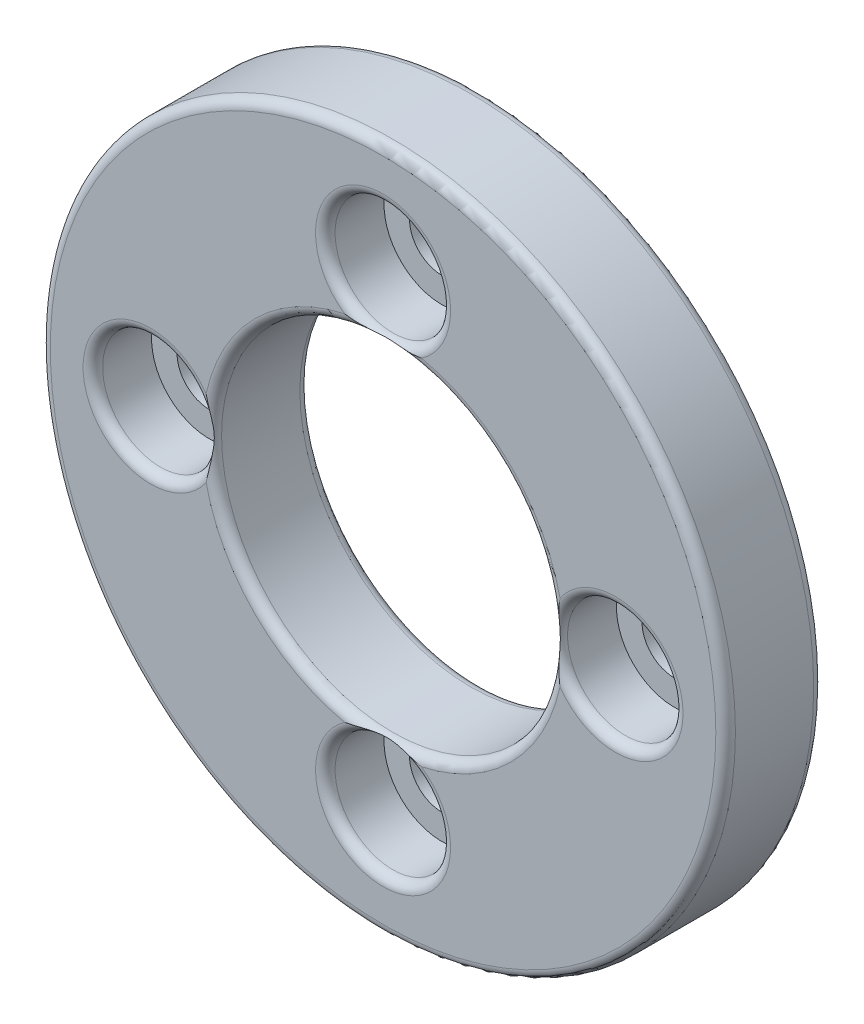
ISO-10303-21;
HEADER;
FILE_DESCRIPTION(('STEP AP214'),'2;1');
FILE_NAME('part.step','',(''),(''),'','','');
FILE_SCHEMA(('AUTOMOTIVE_DESIGN { 1 0 10303 214 1 1 1 1 }'));
ENDSEC;
DATA;
#1=APPLICATION_CONTEXT('core data for automotive mechanical design processes');
#2=APPLICATION_PROTOCOL_DEFINITION('international standard','automotive_design',2000,#1);
#3=PRODUCT_CONTEXT('',#1,'mechanical');
#4=PRODUCT('Part','Part','',(#3));
#5=PRODUCT_RELATED_PRODUCT_CATEGORY('part','',(#4));
#6=PRODUCT_DEFINITION_FORMATION('','',#4);
#7=PRODUCT_DEFINITION_CONTEXT('part definition',#1,'design');
#8=PRODUCT_DEFINITION('design','',#6,#7);
#9=PRODUCT_DEFINITION_SHAPE('','',#8);
#10=(LENGTH_UNIT() NAMED_UNIT(*) SI_UNIT(.MILLI.,.METRE.));
#11=(NAMED_UNIT(*) PLANE_ANGLE_UNIT() SI_UNIT($,.RADIAN.));
#12=(NAMED_UNIT(*) SI_UNIT($,.STERADIAN.) SOLID_ANGLE_UNIT());
#13=UNCERTAINTY_MEASURE_WITH_UNIT(LENGTH_MEASURE(1.E-05),#10,'distance_accuracy_value','');
#14=(GEOMETRIC_REPRESENTATION_CONTEXT(3) GLOBAL_UNCERTAINTY_ASSIGNED_CONTEXT((#13)) GLOBAL_UNIT_ASSIGNED_CONTEXT((#10,
#11,#12)) REPRESENTATION_CONTEXT('',''));
#15=CARTESIAN_POINT('',(0.,0.,0.));
#16=DIRECTION('',(0.,0.,1.));
#17=DIRECTION('',(1.,0.,0.));
#18=AXIS2_PLACEMENT_3D('',#15,#16,#17);
#19=CARTESIAN_POINT('',(0.,11.875,5.));
#20=DIRECTION('',(0.,0.,-1.));
#21=DIRECTION('',(-1.,0.,0.));
#22=AXIS2_PLACEMENT_3D('',#19,#20,#21);
#23=CYLINDRICAL_SURFACE('',#22,1.65);
#24=CARTESIAN_POINT('',(0.,11.875,0.5));
#25=DIRECTION('',(0.,0.,1.));
#26=DIRECTION('',(1.,0.,0.));
#27=AXIS2_PLACEMENT_3D('',#24,#25,#26);
#28=CIRCLE('',#27,1.65);
#29=CARTESIAN_POINT('',(1.65,11.875,0.5));
#30=VERTEX_POINT('',#29);
#31=EDGE_CURVE('E231',#30,#30,#28,.F.);
#32=ORIENTED_EDGE('',*,*,#31,.T.);
#33=EDGE_LOOP('',(#32));
#34=FACE_BOUND('',#33,.T.);
#35=CARTESIAN_POINT('',(0.,11.875,2.));
#36=DIRECTION('',(0.,0.,1.));
#37=DIRECTION('',(1.,0.,0.));
#38=AXIS2_PLACEMENT_3D('',#35,#36,#37);
#39=CIRCLE('',#38,1.65);
#40=CARTESIAN_POINT('',(1.65,11.875,2.));
#41=VERTEX_POINT('',#40);
#42=EDGE_CURVE('E263',#41,#41,#39,.T.);
#43=ORIENTED_EDGE('',*,*,#42,.T.);
#44=EDGE_LOOP('',(#43));
#45=FACE_BOUND('',#44,.T.);
#46=ADVANCED_FACE('F41',(#34,#45),#23,.F.);
#47=CARTESIAN_POINT('',(11.875,0.,5.));
#48=DIRECTION('',(0.,0.,-1.));
#49=DIRECTION('',(-1.,0.,0.));
#50=AXIS2_PLACEMENT_3D('',#47,#48,#49);
#51=CYLINDRICAL_SURFACE('',#50,1.65);
#52=CARTESIAN_POINT('',(11.875,0.,0.5));
#53=DIRECTION('',(0.,0.,1.));
#54=DIRECTION('',(1.,0.,0.));
#55=AXIS2_PLACEMENT_3D('',#52,#53,#54);
#56=CIRCLE('',#55,1.65);
#57=CARTESIAN_POINT('',(13.525,0.,0.5));
#58=VERTEX_POINT('',#57);
#59=EDGE_CURVE('E228',#58,#58,#56,.F.);
#60=ORIENTED_EDGE('',*,*,#59,.T.);
#61=EDGE_LOOP('',(#60));
#62=FACE_BOUND('',#61,.T.);
#63=CARTESIAN_POINT('',(11.875,0.,2.));
#64=DIRECTION('',(0.,0.,1.));
#65=DIRECTION('',(1.,0.,0.));
#66=AXIS2_PLACEMENT_3D('',#63,#64,#65);
#67=CIRCLE('',#66,1.65);
#68=CARTESIAN_POINT('',(13.525,0.,2.));
#69=VERTEX_POINT('',#68);
#70=EDGE_CURVE('E266',#69,#69,#67,.T.);
#71=ORIENTED_EDGE('',*,*,#70,.T.);
#72=EDGE_LOOP('',(#71));
#73=FACE_BOUND('',#72,.T.);
#74=ADVANCED_FACE('F148',(#62,#73),#51,.F.);
#75=CARTESIAN_POINT('',(0.,-11.875,5.));
#76=DIRECTION('',(0.,0.,-1.));
#77=DIRECTION('',(-1.,0.,0.));
#78=AXIS2_PLACEMENT_3D('',#75,#76,#77);
#79=CYLINDRICAL_SURFACE('',#78,1.65);
#80=CARTESIAN_POINT('',(0.,-11.875,0.5));
#81=DIRECTION('',(0.,0.,1.));
#82=DIRECTION('',(1.,0.,0.));
#83=AXIS2_PLACEMENT_3D('',#80,#81,#82);
#84=CIRCLE('',#83,1.65);
#85=CARTESIAN_POINT('',(1.64999999999992,-11.875,0.5));
#86=VERTEX_POINT('',#85);
#87=EDGE_CURVE('E225',#86,#86,#84,.F.);
#88=ORIENTED_EDGE('',*,*,#87,.T.);
#89=EDGE_LOOP('',(#88));
#90=FACE_BOUND('',#89,.T.);
#91=CARTESIAN_POINT('',(0.,-11.875,2.));
#92=DIRECTION('',(0.,0.,1.));
#93=DIRECTION('',(1.,0.,0.));
#94=AXIS2_PLACEMENT_3D('',#91,#92,#93);
#95=CIRCLE('',#94,1.65);
#96=CARTESIAN_POINT('',(1.64999999999992,-11.875,2.));
#97=VERTEX_POINT('',#96);
#98=EDGE_CURVE('E269',#97,#97,#95,.T.);
#99=ORIENTED_EDGE('',*,*,#98,.T.);
#100=EDGE_LOOP('',(#99));
#101=FACE_BOUND('',#100,.T.);
#102=ADVANCED_FACE('F155',(#90,#101),#79,.F.);
#103=CARTESIAN_POINT('',(-11.875,1.24384022696287E-13,5.));
#104=DIRECTION('',(0.,0.,-1.));
#105=DIRECTION('',(-1.,0.,0.));
#106=AXIS2_PLACEMENT_3D('',#103,#104,#105);
#107=CYLINDRICAL_SURFACE('',#106,1.65);
#108=CARTESIAN_POINT('',(-11.875,1.24384022696287E-13,0.5));
#109=DIRECTION('',(0.,0.,1.));
#110=DIRECTION('',(1.,0.,0.));
#111=AXIS2_PLACEMENT_3D('',#108,#109,#110);
#112=CIRCLE('',#111,1.65);
#113=CARTESIAN_POINT('',(-10.225,1.24384022696287E-13,0.5));
#114=VERTEX_POINT('',#113);
#115=EDGE_CURVE('E102',#114,#114,#112,.F.);
#116=ORIENTED_EDGE('',*,*,#115,.T.);
#117=EDGE_LOOP('',(#116));
#118=FACE_BOUND('',#117,.T.);
#119=CARTESIAN_POINT('',(-11.875,1.24384022696287E-13,2.));
#120=DIRECTION('',(0.,0.,1.));
#121=DIRECTION('',(1.,0.,0.));
#122=AXIS2_PLACEMENT_3D('',#119,#120,#121);
#123=CIRCLE('',#122,1.65);
#124=CARTESIAN_POINT('',(-10.225,1.24384022696287E-13,2.));
#125=VERTEX_POINT('',#124);
#126=EDGE_CURVE('E272',#125,#125,#123,.T.);
#127=ORIENTED_EDGE('',*,*,#126,.T.);
#128=EDGE_LOOP('',(#127));
#129=FACE_BOUND('',#128,.T.);
#130=ADVANCED_FACE('F166',(#118,#129),#107,.F.);
#131=CARTESIAN_POINT('',(0.,0.,5.));
#132=DIRECTION('',(0.,0.,-1.));
#133=DIRECTION('',(-1.,0.,0.));
#134=AXIS2_PLACEMENT_3D('',#131,#132,#133);
#135=CYLINDRICAL_SURFACE('',#134,8.75);
#136=CARTESIAN_POINT('',(0.,0.,0.5));
#137=DIRECTION('',(0.,0.,1.));
#138=DIRECTION('',(1.,0.,0.));
#139=AXIS2_PLACEMENT_3D('',#136,#137,#138);
#140=CIRCLE('',#139,8.75);
#141=CARTESIAN_POINT('',(8.75,0.,0.5));
#142=VERTEX_POINT('',#141);
#143=EDGE_CURVE('E233',#142,#142,#140,.F.);
#144=ORIENTED_EDGE('',*,*,#143,.T.);
#145=EDGE_LOOP('',(#144));
#146=FACE_BOUND('',#145,.T.);
#147=CARTESIAN_POINT('',(0.,0.,4.5));
#148=DIRECTION('',(0.,0.,1.));
#149=DIRECTION('',(1.,0.,0.));
#150=AXIS2_PLACEMENT_3D('',#147,#148,#149);
#151=CIRCLE('',#150,8.75);
#152=CARTESIAN_POINT('',(8.75,0.,4.5));
#153=VERTEX_POINT('',#152);
#154=EDGE_CURVE('E236',#153,#153,#151,.T.);
#155=ORIENTED_EDGE('',*,*,#154,.T.);
#156=EDGE_LOOP('',(#155));
#157=FACE_BOUND('',#156,.T.);
#158=ADVANCED_FACE('F161',(#146,#157),#135,.F.);
#159=CARTESIAN_POINT('',(0.,0.,5.));
#160=DIRECTION('',(0.,0.,-1.));
#161=DIRECTION('',(-1.,0.,0.));
#162=AXIS2_PLACEMENT_3D('',#159,#160,#161);
#163=CYLINDRICAL_SURFACE('',#162,17.5);
#164=CARTESIAN_POINT('',(0.,0.,0.5));
#165=DIRECTION('',(0.,0.,1.));
#166=DIRECTION('',(1.,0.,0.));
#167=AXIS2_PLACEMENT_3D('',#164,#165,#166);
#168=CIRCLE('',#167,17.5);
#169=CARTESIAN_POINT('',(17.5,0.,0.5));
#170=VERTEX_POINT('',#169);
#171=EDGE_CURVE('E257',#170,#170,#168,.T.);
#172=ORIENTED_EDGE('',*,*,#171,.T.);
#173=EDGE_LOOP('',(#172));
#174=FACE_BOUND('',#173,.T.);
#175=CARTESIAN_POINT('',(0.,0.,4.5));
#176=DIRECTION('',(0.,0.,1.));
#177=DIRECTION('',(1.,0.,0.));
#178=AXIS2_PLACEMENT_3D('',#175,#176,#177);
#179=CIRCLE('',#178,17.5);
#180=CARTESIAN_POINT('',(17.5,0.,4.5));
#181=VERTEX_POINT('',#180);
#182=EDGE_CURVE('E260',#181,#181,#179,.F.);
#183=ORIENTED_EDGE('',*,*,#182,.T.);
#184=EDGE_LOOP('',(#183));
#185=FACE_BOUND('',#184,.T.);
#186=ADVANCED_FACE('F321',(#174,#185),#163,.T.);
#187=CARTESIAN_POINT('',(0.,0.,5.));
#188=DIRECTION('',(0.,0.,1.));
#189=DIRECTION('',(1.,0.,0.));
#190=AXIS2_PLACEMENT_3D('',#187,#188,#189);
#191=PLANE('',#190);
#192=CARTESIAN_POINT('',(0.,0.,5.));
#193=DIRECTION('',(0.,0.,1.));
#194=DIRECTION('',(1.,0.,0.));
#195=AXIS2_PLACEMENT_3D('',#192,#193,#194);
#196=CIRCLE('',#195,17.);
#197=CARTESIAN_POINT('',(17.,0.,5.));
#198=VERTEX_POINT('',#197);
#199=EDGE_CURVE('E212',#198,#198,#196,.T.);
#200=ORIENTED_EDGE('',*,*,#199,.T.);
#201=EDGE_LOOP('',(#200));
#202=FACE_BOUND('',#201,.T.);
#203=CARTESIAN_POINT('',(0.,0.,5.));
#204=DIRECTION('',(0.,0.,1.));
#205=DIRECTION('',(1.,0.,0.));
#206=AXIS2_PLACEMENT_3D('',#203,#204,#205);
#207=CIRCLE('',#206,9.25);
#208=CARTESIAN_POINT('',(9.03897368421052,-1.96454949954174,5.));
#209=VERTEX_POINT('',#208);
#210=CARTESIAN_POINT('',(1.96454949954165,-9.03897368421054,5.));
#211=VERTEX_POINT('',#210);
#212=EDGE_CURVE('E63',#209,#211,#207,.F.);
#213=ORIENTED_EDGE('',*,*,#212,.T.);
#214=CARTESIAN_POINT('',(0.,-11.875,5.));
#215=DIRECTION('',(0.,0.,1.));
#216=DIRECTION('',(1.,0.,0.));
#217=AXIS2_PLACEMENT_3D('',#214,#215,#216);
#218=CIRCLE('',#217,3.45);
#219=CARTESIAN_POINT('',(-1.96454949954178,-9.03897368421051,5.));
#220=VERTEX_POINT('',#219);
#221=EDGE_CURVE('E67',#211,#220,#218,.F.);
#222=ORIENTED_EDGE('',*,*,#221,.T.);
#223=CARTESIAN_POINT('',(0.,0.,5.));
#224=DIRECTION('',(0.,0.,1.));
#225=DIRECTION('',(1.,0.,0.));
#226=AXIS2_PLACEMENT_3D('',#223,#224,#225);
#227=CIRCLE('',#226,9.25);
#228=CARTESIAN_POINT('',(-9.03897368421055,-1.96454949954162,5.));
#229=VERTEX_POINT('',#228);
#230=EDGE_CURVE('E217',#220,#229,#227,.F.);
#231=ORIENTED_EDGE('',*,*,#230,.T.);
#232=CARTESIAN_POINT('',(-11.875,1.24384022696287E-13,5.));
#233=DIRECTION('',(0.,0.,1.));
#234=DIRECTION('',(1.,0.,0.));
#235=AXIS2_PLACEMENT_3D('',#232,#233,#234);
#236=CIRCLE('',#235,3.45);
#237=CARTESIAN_POINT('',(-9.03897368421051,1.96454949954181,5.));
#238=VERTEX_POINT('',#237);
#239=EDGE_CURVE('E92',#229,#238,#236,.F.);
#240=ORIENTED_EDGE('',*,*,#239,.T.);
#241=CARTESIAN_POINT('',(0.,0.,5.));
#242=DIRECTION('',(0.,0.,1.));
#243=DIRECTION('',(1.,0.,0.));
#244=AXIS2_PLACEMENT_3D('',#241,#242,#243);
#245=CIRCLE('',#244,9.25);
#246=CARTESIAN_POINT('',(-1.96454949954171,9.03897368421053,5.));
#247=VERTEX_POINT('',#246);
#248=EDGE_CURVE('E85',#238,#247,#245,.F.);
#249=ORIENTED_EDGE('',*,*,#248,.T.);
#250=CARTESIAN_POINT('',(0.,11.875,5.));
#251=DIRECTION('',(0.,0.,1.));
#252=DIRECTION('',(1.,0.,0.));
#253=AXIS2_PLACEMENT_3D('',#250,#251,#252);
#254=CIRCLE('',#253,3.45);
#255=CARTESIAN_POINT('',(1.96454949954171,9.03897368421053,5.));
#256=VERTEX_POINT('',#255);
#257=EDGE_CURVE('E89',#247,#256,#254,.F.);
#258=ORIENTED_EDGE('',*,*,#257,.T.);
#259=CARTESIAN_POINT('',(0.,0.,5.));
#260=DIRECTION('',(0.,0.,1.));
#261=DIRECTION('',(1.,0.,0.));
#262=AXIS2_PLACEMENT_3D('',#259,#260,#261);
#263=CIRCLE('',#262,9.25);
#264=CARTESIAN_POINT('',(9.03897368421054,1.96454949954168,5.));
#265=VERTEX_POINT('',#264);
#266=EDGE_CURVE('E97',#256,#265,#263,.F.);
#267=ORIENTED_EDGE('',*,*,#266,.T.);
#268=CARTESIAN_POINT('',(11.875,0.,5.));
#269=DIRECTION('',(0.,0.,1.));
#270=DIRECTION('',(1.,0.,0.));
#271=AXIS2_PLACEMENT_3D('',#268,#269,#270);
#272=CIRCLE('',#271,3.45);
#273=EDGE_CURVE('E220',#265,#209,#272,.F.);
#274=ORIENTED_EDGE('',*,*,#273,.T.);
#275=EDGE_LOOP('',(#213,#222,#231,#240,#249,#258,#267,#274));
#276=FACE_BOUND('',#275,.T.);
#277=ADVANCED_FACE('F87',(#202,#276),#191,.T.);
#278=CARTESIAN_POINT('',(0.,0.,0.));
#279=DIRECTION('',(0.,0.,1.));
#280=DIRECTION('',(1.,0.,0.));
#281=AXIS2_PLACEMENT_3D('',#278,#279,#280);
#282=PLANE('',#281);
#283=CARTESIAN_POINT('',(0.,0.,0.));
#284=DIRECTION('',(0.,0.,1.));
#285=DIRECTION('',(1.,0.,0.));
#286=AXIS2_PLACEMENT_3D('',#283,#284,#285);
#287=CIRCLE('',#286,17.);
#288=CARTESIAN_POINT('',(17.,0.,0.));
#289=VERTEX_POINT('',#288);
#290=EDGE_CURVE('E239',#289,#289,#287,.F.);
#291=ORIENTED_EDGE('',*,*,#290,.T.);
#292=EDGE_LOOP('',(#291));
#293=FACE_BOUND('',#292,.T.);
#294=CARTESIAN_POINT('',(0.,0.,0.));
#295=DIRECTION('',(0.,0.,1.));
#296=DIRECTION('',(1.,0.,0.));
#297=AXIS2_PLACEMENT_3D('',#294,#295,#296);
#298=CIRCLE('',#297,9.25);
#299=CARTESIAN_POINT('',(9.25,0.,0.));
#300=VERTEX_POINT('',#299);
#301=EDGE_CURVE('E242',#300,#300,#298,.T.);
#302=ORIENTED_EDGE('',*,*,#301,.T.);
#303=EDGE_LOOP('',(#302));
#304=FACE_BOUND('',#303,.T.);
#305=CARTESIAN_POINT('',(0.,11.875,0.));
#306=DIRECTION('',(0.,0.,1.));
#307=DIRECTION('',(1.,0.,0.));
#308=AXIS2_PLACEMENT_3D('',#305,#306,#307);
#309=CIRCLE('',#308,2.15);
#310=CARTESIAN_POINT('',(2.15,11.875,0.));
#311=VERTEX_POINT('',#310);
#312=EDGE_CURVE('E245',#311,#311,#309,.T.);
#313=ORIENTED_EDGE('',*,*,#312,.T.);
#314=EDGE_LOOP('',(#313));
#315=FACE_BOUND('',#314,.T.);
#316=CARTESIAN_POINT('',(11.875,0.,0.));
#317=DIRECTION('',(0.,0.,1.));
#318=DIRECTION('',(1.,0.,0.));
#319=AXIS2_PLACEMENT_3D('',#316,#317,#318);
#320=CIRCLE('',#319,2.15);
#321=CARTESIAN_POINT('',(14.025,0.,0.));
#322=VERTEX_POINT('',#321);
#323=EDGE_CURVE('E248',#322,#322,#320,.T.);
#324=ORIENTED_EDGE('',*,*,#323,.T.);
#325=EDGE_LOOP('',(#324));
#326=FACE_BOUND('',#325,.T.);
#327=CARTESIAN_POINT('',(0.,-11.875,0.));
#328=DIRECTION('',(0.,0.,1.));
#329=DIRECTION('',(1.,0.,0.));
#330=AXIS2_PLACEMENT_3D('',#327,#328,#329);
#331=CIRCLE('',#330,2.15);
#332=CARTESIAN_POINT('',(2.14999999999992,-11.875,0.));
#333=VERTEX_POINT('',#332);
#334=EDGE_CURVE('E251',#333,#333,#331,.T.);
#335=ORIENTED_EDGE('',*,*,#334,.T.);
#336=EDGE_LOOP('',(#335));
#337=FACE_BOUND('',#336,.T.);
#338=CARTESIAN_POINT('',(-11.875,1.24384022696287E-13,0.));
#339=DIRECTION('',(0.,0.,1.));
#340=DIRECTION('',(1.,0.,0.));
#341=AXIS2_PLACEMENT_3D('',#338,#339,#340);
#342=CIRCLE('',#341,2.15);
#343=CARTESIAN_POINT('',(-9.725,1.24384022696287E-13,0.));
#344=VERTEX_POINT('',#343);
#345=EDGE_CURVE('E254',#344,#344,#342,.T.);
#346=ORIENTED_EDGE('',*,*,#345,.T.);
#347=EDGE_LOOP('',(#346));
#348=FACE_BOUND('',#347,.T.);
#349=ADVANCED_FACE('F314',(#293,#304,#315,#326,#337,#348),#282,.F.);
#350=CARTESIAN_POINT('',(-11.875,1.24384022696287E-13,2.));
#351=DIRECTION('',(0.,0.,1.));
#352=DIRECTION('',(1.,0.,0.));
#353=AXIS2_PLACEMENT_3D('',#350,#351,#352);
#354=CYLINDRICAL_SURFACE('',#353,2.95);
#355=CARTESIAN_POINT('',(-11.875,1.24384022696287E-13,4.5));
#356=DIRECTION('',(0.,0.,1.));
#357=DIRECTION('',(1.,0.,0.));
#358=AXIS2_PLACEMENT_3D('',#355,#356,#357);
#359=CIRCLE('',#358,2.95);
#360=CARTESIAN_POINT('',(-8.925,1.24384022696287E-13,4.5));
#361=VERTEX_POINT('',#360);
#362=EDGE_CURVE('E209',#361,#361,#359,.T.);
#363=ORIENTED_EDGE('',*,*,#362,.T.);
#364=EDGE_LOOP('',(#363));
#365=FACE_BOUND('',#364,.T.);
#366=CARTESIAN_POINT('',(-11.875,1.24384022696287E-13,2.));
#367=DIRECTION('',(0.,0.,1.));
#368=DIRECTION('',(1.,0.,0.));
#369=AXIS2_PLACEMENT_3D('',#366,#367,#368);
#370=CIRCLE('',#369,2.95);
#371=CARTESIAN_POINT('',(-8.925,1.24384022696287E-13,2.));
#372=VERTEX_POINT('',#371);
#373=EDGE_CURVE('E105',#372,#372,#370,.T.);
#374=ORIENTED_EDGE('',*,*,#373,.F.);
#375=EDGE_LOOP('',(#374));
#376=FACE_BOUND('',#375,.T.);
#377=ADVANCED_FACE('F311',(#365,#376),#354,.F.);
#378=CARTESIAN_POINT('',(-11.875,1.24384022696287E-13,2.));
#379=DIRECTION('',(0.,0.,1.));
#380=DIRECTION('',(1.,0.,0.));
#381=AXIS2_PLACEMENT_3D('',#378,#379,#380);
#382=PLANE('',#381);
#383=ORIENTED_EDGE('',*,*,#126,.F.);
#384=EDGE_LOOP('',(#383));
#385=FACE_BOUND('',#384,.T.);
#386=ORIENTED_EDGE('',*,*,#373,.T.);
#387=EDGE_LOOP('',(#386));
#388=FACE_BOUND('',#387,.T.);
#389=ADVANCED_FACE('F306',(#385,#388),#382,.T.);
#390=CARTESIAN_POINT('',(0.,-11.875,2.));
#391=DIRECTION('',(0.,0.,1.));
#392=DIRECTION('',(1.,0.,0.));
#393=AXIS2_PLACEMENT_3D('',#390,#391,#392);
#394=CYLINDRICAL_SURFACE('',#393,2.95);
#395=CARTESIAN_POINT('',(0.,-11.875,4.5));
#396=DIRECTION('',(0.,0.,1.));
#397=DIRECTION('',(1.,0.,0.));
#398=AXIS2_PLACEMENT_3D('',#395,#396,#397);
#399=CIRCLE('',#398,2.95);
#400=CARTESIAN_POINT('',(2.94999999999992,-11.875,4.5));
#401=VERTEX_POINT('',#400);
#402=EDGE_CURVE('E206',#401,#401,#399,.T.);
#403=ORIENTED_EDGE('',*,*,#402,.T.);
#404=EDGE_LOOP('',(#403));
#405=FACE_BOUND('',#404,.T.);
#406=CARTESIAN_POINT('',(0.,-11.875,2.));
#407=DIRECTION('',(0.,0.,1.));
#408=DIRECTION('',(1.,0.,0.));
#409=AXIS2_PLACEMENT_3D('',#406,#407,#408);
#410=CIRCLE('',#409,2.95);
#411=CARTESIAN_POINT('',(2.94999999999992,-11.875,2.));
#412=VERTEX_POINT('',#411);
#413=EDGE_CURVE('E108',#412,#412,#410,.T.);
#414=ORIENTED_EDGE('',*,*,#413,.F.);
#415=EDGE_LOOP('',(#414));
#416=FACE_BOUND('',#415,.T.);
#417=ADVANCED_FACE('F303',(#405,#416),#394,.F.);
#418=CARTESIAN_POINT('',(0.,-11.875,2.));
#419=DIRECTION('',(0.,0.,1.));
#420=DIRECTION('',(1.,0.,0.));
#421=AXIS2_PLACEMENT_3D('',#418,#419,#420);
#422=PLANE('',#421);
#423=ORIENTED_EDGE('',*,*,#98,.F.);
#424=EDGE_LOOP('',(#423));
#425=FACE_BOUND('',#424,.T.);
#426=ORIENTED_EDGE('',*,*,#413,.T.);
#427=EDGE_LOOP('',(#426));
#428=FACE_BOUND('',#427,.T.);
#429=ADVANCED_FACE('F300',(#425,#428),#422,.T.);
#430=CARTESIAN_POINT('',(11.875,0.,2.));
#431=DIRECTION('',(0.,0.,1.));
#432=DIRECTION('',(1.,0.,0.));
#433=AXIS2_PLACEMENT_3D('',#430,#431,#432);
#434=CYLINDRICAL_SURFACE('',#433,2.95);
#435=CARTESIAN_POINT('',(11.875,0.,4.5));
#436=DIRECTION('',(0.,0.,1.));
#437=DIRECTION('',(1.,0.,0.));
#438=AXIS2_PLACEMENT_3D('',#435,#436,#437);
#439=CIRCLE('',#438,2.95);
#440=CARTESIAN_POINT('',(14.825,0.,4.5));
#441=VERTEX_POINT('',#440);
#442=EDGE_CURVE('E55',#441,#441,#439,.T.);
#443=ORIENTED_EDGE('',*,*,#442,.T.);
#444=EDGE_LOOP('',(#443));
#445=FACE_BOUND('',#444,.T.);
#446=CARTESIAN_POINT('',(11.875,0.,2.));
#447=DIRECTION('',(0.,0.,1.));
#448=DIRECTION('',(1.,0.,0.));
#449=AXIS2_PLACEMENT_3D('',#446,#447,#448);
#450=CIRCLE('',#449,2.95);
#451=CARTESIAN_POINT('',(14.825,0.,2.));
#452=VERTEX_POINT('',#451);
#453=EDGE_CURVE('E278',#452,#452,#450,.T.);
#454=ORIENTED_EDGE('',*,*,#453,.F.);
#455=EDGE_LOOP('',(#454));
#456=FACE_BOUND('',#455,.T.);
#457=ADVANCED_FACE('F296',(#445,#456),#434,.F.);
#458=CARTESIAN_POINT('',(11.875,0.,2.));
#459=DIRECTION('',(0.,0.,1.));
#460=DIRECTION('',(1.,0.,0.));
#461=AXIS2_PLACEMENT_3D('',#458,#459,#460);
#462=PLANE('',#461);
#463=ORIENTED_EDGE('',*,*,#70,.F.);
#464=EDGE_LOOP('',(#463));
#465=FACE_BOUND('',#464,.T.);
#466=ORIENTED_EDGE('',*,*,#453,.T.);
#467=EDGE_LOOP('',(#466));
#468=FACE_BOUND('',#467,.T.);
#469=ADVANCED_FACE('F287',(#465,#468),#462,.T.);
#470=CARTESIAN_POINT('',(0.,11.875,2.));
#471=DIRECTION('',(0.,0.,1.));
#472=DIRECTION('',(1.,0.,0.));
#473=AXIS2_PLACEMENT_3D('',#470,#471,#472);
#474=CYLINDRICAL_SURFACE('',#473,2.95);
#475=CARTESIAN_POINT('',(0.,11.875,4.5));
#476=DIRECTION('',(0.,0.,1.));
#477=DIRECTION('',(1.,0.,0.));
#478=AXIS2_PLACEMENT_3D('',#475,#476,#477);
#479=CIRCLE('',#478,2.95);
#480=CARTESIAN_POINT('',(2.95,11.875,4.5));
#481=VERTEX_POINT('',#480);
#482=EDGE_CURVE('E11',#481,#481,#479,.T.);
#483=ORIENTED_EDGE('',*,*,#482,.T.);
#484=EDGE_LOOP('',(#483));
#485=FACE_BOUND('',#484,.T.);
#486=CARTESIAN_POINT('',(0.,11.875,2.));
#487=DIRECTION('',(0.,0.,1.));
#488=DIRECTION('',(1.,0.,0.));
#489=AXIS2_PLACEMENT_3D('',#486,#487,#488);
#490=CIRCLE('',#489,2.95);
#491=CARTESIAN_POINT('',(2.95,11.875,2.));
#492=VERTEX_POINT('',#491);
#493=EDGE_CURVE('E274',#492,#492,#490,.T.);
#494=ORIENTED_EDGE('',*,*,#493,.F.);
#495=EDGE_LOOP('',(#494));
#496=FACE_BOUND('',#495,.T.);
#497=ADVANCED_FACE('F285',(#485,#496),#474,.F.);
#498=CARTESIAN_POINT('',(0.,11.875,2.));
#499=DIRECTION('',(0.,0.,1.));
#500=DIRECTION('',(1.,0.,0.));
#501=AXIS2_PLACEMENT_3D('',#498,#499,#500);
#502=PLANE('',#501);
#503=ORIENTED_EDGE('',*,*,#42,.F.);
#504=EDGE_LOOP('',(#503));
#505=FACE_BOUND('',#504,.T.);
#506=ORIENTED_EDGE('',*,*,#493,.T.);
#507=EDGE_LOOP('',(#506));
#508=FACE_BOUND('',#507,.T.);
#509=ADVANCED_FACE('F175',(#505,#508),#502,.T.);
#510=CARTESIAN_POINT('',(0.,0.,0.5));
#511=DIRECTION('',(0.,0.,1.));
#512=DIRECTION('',(1.,0.,0.));
#513=AXIS2_PLACEMENT_3D('',#510,#511,#512);
#514=TOROIDAL_SURFACE('',#513,17.,0.5);
#515=ORIENTED_EDGE('',*,*,#290,.F.);
#516=EDGE_LOOP('',(#515));
#517=FACE_BOUND('',#516,.T.);
#518=ORIENTED_EDGE('',*,*,#171,.F.);
#519=EDGE_LOOP('',(#518));
#520=FACE_BOUND('',#519,.T.);
#521=ADVANCED_FACE('F171',(#517,#520),#514,.T.);
#522=CARTESIAN_POINT('',(0.,0.,0.5));
#523=DIRECTION('',(0.,0.,1.));
#524=DIRECTION('',(1.,0.,0.));
#525=AXIS2_PLACEMENT_3D('',#522,#523,#524);
#526=TOROIDAL_SURFACE('',#525,9.25,0.5);
#527=ORIENTED_EDGE('',*,*,#143,.F.);
#528=EDGE_LOOP('',(#527));
#529=FACE_BOUND('',#528,.T.);
#530=ORIENTED_EDGE('',*,*,#301,.F.);
#531=EDGE_LOOP('',(#530));
#532=FACE_BOUND('',#531,.T.);
#533=ADVANCED_FACE('F174',(#529,#532),#526,.T.);
#534=CARTESIAN_POINT('',(0.,11.875,0.5));
#535=DIRECTION('',(0.,0.,1.));
#536=DIRECTION('',(1.,0.,0.));
#537=AXIS2_PLACEMENT_3D('',#534,#535,#536);
#538=TOROIDAL_SURFACE('',#537,2.15,0.5);
#539=ORIENTED_EDGE('',*,*,#31,.F.);
#540=EDGE_LOOP('',(#539));
#541=FACE_BOUND('',#540,.T.);
#542=ORIENTED_EDGE('',*,*,#312,.F.);
#543=EDGE_LOOP('',(#542));
#544=FACE_BOUND('',#543,.T.);
#545=ADVANCED_FACE('F179',(#541,#544),#538,.T.);
#546=CARTESIAN_POINT('',(11.875,0.,0.5));
#547=DIRECTION('',(0.,0.,1.));
#548=DIRECTION('',(1.,0.,0.));
#549=AXIS2_PLACEMENT_3D('',#546,#547,#548);
#550=TOROIDAL_SURFACE('',#549,2.15,0.5);
#551=ORIENTED_EDGE('',*,*,#59,.F.);
#552=EDGE_LOOP('',(#551));
#553=FACE_BOUND('',#552,.T.);
#554=ORIENTED_EDGE('',*,*,#323,.F.);
#555=EDGE_LOOP('',(#554));
#556=FACE_BOUND('',#555,.T.);
#557=ADVANCED_FACE('F183',(#553,#556),#550,.T.);
#558=CARTESIAN_POINT('',(0.,-11.875,0.5));
#559=DIRECTION('',(0.,0.,1.));
#560=DIRECTION('',(1.,0.,0.));
#561=AXIS2_PLACEMENT_3D('',#558,#559,#560);
#562=TOROIDAL_SURFACE('',#561,2.15,0.5);
#563=ORIENTED_EDGE('',*,*,#87,.F.);
#564=EDGE_LOOP('',(#563));
#565=FACE_BOUND('',#564,.T.);
#566=ORIENTED_EDGE('',*,*,#334,.F.);
#567=EDGE_LOOP('',(#566));
#568=FACE_BOUND('',#567,.T.);
#569=ADVANCED_FACE('F187',(#565,#568),#562,.T.);
#570=CARTESIAN_POINT('',(-11.875,1.24384022696287E-13,0.5));
#571=DIRECTION('',(0.,0.,1.));
#572=DIRECTION('',(1.,0.,0.));
#573=AXIS2_PLACEMENT_3D('',#570,#571,#572);
#574=TOROIDAL_SURFACE('',#573,2.15,0.5);
#575=ORIENTED_EDGE('',*,*,#115,.F.);
#576=EDGE_LOOP('',(#575));
#577=FACE_BOUND('',#576,.T.);
#578=ORIENTED_EDGE('',*,*,#345,.F.);
#579=EDGE_LOOP('',(#578));
#580=FACE_BOUND('',#579,.T.);
#581=ADVANCED_FACE('F143',(#577,#580),#574,.T.);
#582=CARTESIAN_POINT('',(0.,0.,4.5));
#583=DIRECTION('',(0.,0.,1.));
#584=DIRECTION('',(1.,0.,0.));
#585=AXIS2_PLACEMENT_3D('',#582,#583,#584);
#586=TOROIDAL_SURFACE('',#585,17.,0.5);
#587=ORIENTED_EDGE('',*,*,#182,.F.);
#588=EDGE_LOOP('',(#587));
#589=FACE_BOUND('',#588,.T.);
#590=ORIENTED_EDGE('',*,*,#199,.F.);
#591=EDGE_LOOP('',(#590));
#592=FACE_BOUND('',#591,.T.);
#593=ADVANCED_FACE('F138',(#589,#592),#586,.T.);
#594=CARTESIAN_POINT('',(0.,11.875,4.5));
#595=DIRECTION('',(0.,0.,1.));
#596=DIRECTION('',(1.,0.,0.));
#597=AXIS2_PLACEMENT_3D('',#594,#595,#596);
#598=TOROIDAL_SURFACE('',#597,3.45,0.5);
#599=ORIENTED_EDGE('',*,*,#482,.F.);
#600=EDGE_LOOP('',(#599));
#601=FACE_BOUND('',#600,.T.);
#602=CARTESIAN_POINT('',(1.96454949954172,9.03897368421053,5.));
#603=CARTESIAN_POINT('',(1.96283933896346,9.03863430657583,4.99999999012031));
#604=CARTESIAN_POINT('',(1.96112909778161,9.03829530133921,4.99999854212088));
#605=CARTESIAN_POINT('',(1.87723914507064,9.02168564320589,4.99985738293875));
#606=CARTESIAN_POINT('',(1.7948778191173,9.0062761546058,4.9964178303862));
#607=CARTESIAN_POINT('',(1.63016951197191,8.97734241283759,4.98475532883947));
#608=CARTESIAN_POINT('',(1.5478225632419,8.96381919499759,4.97652976562888));
#609=CARTESIAN_POINT('',(1.38290573662979,8.93869470048485,4.95673665070483));
#610=CARTESIAN_POINT('',(1.30033629289713,8.92710136654433,4.94515580037157));
#611=CARTESIAN_POINT('',(1.13516868740893,8.90594810302319,4.92005555054255));
#612=CARTESIAN_POINT('',(1.05257056369242,8.8963899606616,4.90653446451039));
#613=CARTESIAN_POINT('',(0.901584179040146,8.88083970123252,4.88146057824304));
#614=CARTESIAN_POINT('',(0.833218547352821,8.87451657202294,4.86997360666447));
#615=CARTESIAN_POINT('',(0.696232650107684,8.86332069875514,4.84773253224765));
#616=CARTESIAN_POINT('',(0.627612341743864,8.85844821084198,4.83697855909581));
#617=CARTESIAN_POINT('',(0.490215435463109,8.85020171150628,4.81747212928546));
#618=CARTESIAN_POINT('',(0.421440087185376,8.84682284048888,4.80871322728256));
#619=CARTESIAN_POINT('',(0.283493258307935,8.84158277609871,4.79453544641284));
#620=CARTESIAN_POINT('',(0.2143219427093,8.83972099118143,4.78911526590806));
#621=CARTESIAN_POINT('',(0.0758419712461358,8.83755250315709,4.7827533551357));
#622=CARTESIAN_POINT('',(0.00653370253511934,8.83724335866717,4.78180459412112));
#623=CARTESIAN_POINT('',(-0.131983353838471,8.83818166711729,4.78459639315911));
#624=CARTESIAN_POINT('',(-0.201192119524323,8.8394294228975,4.78833786553224));
#625=CARTESIAN_POINT('',(-0.33943840987396,8.84345914352983,4.79967874869694));
#626=CARTESIAN_POINT('',(-0.408474764194618,8.84624578701983,4.80728991879725));
#627=CARTESIAN_POINT('',(-0.546140587361147,8.85331433851905,4.82502034166074));
#628=CARTESIAN_POINT('',(-0.614769993306288,8.85759647185462,4.83513997230841));
#629=CARTESIAN_POINT('',(-0.787725794085276,8.87025283399344,4.86218482129235));
#630=CARTESIAN_POINT('',(-0.891854549516957,8.87959489762722,4.87989137697253));
#631=CARTESIAN_POINT('',(-1.0998283159486,8.90156880605007,4.91432199190843));
#632=CARTESIAN_POINT('',(-1.20367350449942,8.91419743902797,4.93104699094581));
#633=CARTESIAN_POINT('',(-1.4113018411975,8.94263552429277,4.96060945737526));
#634=CARTESIAN_POINT('',(-1.51508473965038,8.95843895889107,4.97345416605544));
#635=CARTESIAN_POINT('',(-1.72276902684514,8.9931115251052,4.99248031658727));
#636=CARTESIAN_POINT('',(-1.8266702552147,9.01197820319432,4.998667061178));
#637=CARTESIAN_POINT('',(-1.94003188387252,9.03413061984807,4.99991652917362));
#638=CARTESIAN_POINT('',(-1.94972646457107,9.03603764716811,4.99997927190023));
#639=CARTESIAN_POINT('',(-1.96112908941852,9.03829530106435,4.99999855681202));
#640=CARTESIAN_POINT('',(-1.96283933033153,9.03863430636855,5.00000000613453));
#641=CARTESIAN_POINT('',(-1.96454949954171,9.03897368421053,5.));
#642=B_SPLINE_CURVE_WITH_KNOTS('',3,(#602,#603,#604,#605,#606,#607,#608,#609,#610,#611,#612,
#613,#614,#615,#616,#617,#618,#619,#620,#621,#622,#623,#624,#625,#626,#627,#628,#629,#630,#631,
#632,#633,#634,#635,#636,#637,#638,#639,#640,#641),.UNSPECIFIED.,.F.,.F.,(4,2,2,2,2,2,2,2,2,2,2,
2,2,2,2,2,2,2,2,4),(0.,0.00523054899057084,0.256554643718461,0.508016145825905,
0.760488274034716,1.01318120644321,1.22200306433044,1.43086177282,1.63903585026912,
1.8471287172717,2.05489427489979,2.2627002523086,2.47114152271767,2.67961421265385,
2.99766435541645,3.31540484216517,3.63254865458139,3.94943969027503,3.97908114405192,
3.9843116930425),.UNSPECIFIED.);
#643=EDGE_CURVE('E45',#256,#247,#642,.T.);
#644=ORIENTED_EDGE('',*,*,#643,.F.);
#645=ORIENTED_EDGE('',*,*,#257,.F.);
#646=EDGE_LOOP('',(#644,#645));
#647=FACE_BOUND('',#646,.T.);
#648=ADVANCED_FACE('F100',(#601,#647),#598,.T.);
#649=CARTESIAN_POINT('',(11.875,0.,4.5));
#650=DIRECTION('',(0.,0.,1.));
#651=DIRECTION('',(1.,0.,0.));
#652=AXIS2_PLACEMENT_3D('',#649,#650,#651);
#653=TOROIDAL_SURFACE('',#652,3.45,0.5);
#654=ORIENTED_EDGE('',*,*,#442,.F.);
#655=EDGE_LOOP('',(#654));
#656=FACE_BOUND('',#655,.T.);
#657=CARTESIAN_POINT('',(9.03897368421052,-1.96454949954175,5.));
#658=CARTESIAN_POINT('',(9.03863430657582,-1.96283933896349,4.99999999012031));
#659=CARTESIAN_POINT('',(9.0382953013392,-1.96112909778164,4.99999854212088));
#660=CARTESIAN_POINT('',(9.02168564320588,-1.87723914507067,4.99985738293875));
#661=CARTESIAN_POINT('',(9.00627615460579,-1.79487781911733,4.9964178303862));
#662=CARTESIAN_POINT('',(8.97734241283759,-1.63016951197194,4.98475532883947));
#663=CARTESIAN_POINT('',(8.96381919499759,-1.54782256324193,4.97652976562888));
#664=CARTESIAN_POINT('',(8.93869470048485,-1.38290573662982,4.95673665070483));
#665=CARTESIAN_POINT('',(8.92710136654433,-1.30033629289717,4.94515580037157));
#666=CARTESIAN_POINT('',(8.90594810302318,-1.13516868740897,4.92005555054255));
#667=CARTESIAN_POINT('',(8.89638996066159,-1.05257056369246,4.90653446451039));
#668=CARTESIAN_POINT('',(8.88083970123251,-0.901584179040185,4.88146057824304));
#669=CARTESIAN_POINT('',(8.87451657202293,-0.833218547352859,4.86997360666447));
#670=CARTESIAN_POINT('',(8.86332069875514,-0.69623265010772,4.84773253224765));
#671=CARTESIAN_POINT('',(8.85844821084198,-0.627612341743899,4.83697855909581));
#672=CARTESIAN_POINT('',(8.85020171150628,-0.490215435463141,4.81747212928546));
#673=CARTESIAN_POINT('',(8.84682284048888,-0.421440087185407,4.80871322728256));
#674=CARTESIAN_POINT('',(8.84158277609871,-0.283493258307965,4.79453544641284));
#675=CARTESIAN_POINT('',(8.83972099118142,-0.214321942709329,4.78911526590806));
#676=CARTESIAN_POINT('',(8.83755250315709,-0.0758419712461623,4.7827533551357));
#677=CARTESIAN_POINT('',(8.83724335866717,-0.00653370253514508,4.78180459412112));
#678=CARTESIAN_POINT('',(8.83818166711729,0.131983353838447,4.78459639315911));
#679=CARTESIAN_POINT('',(8.8394294228975,0.2011921195243,4.78833786553224));
#680=CARTESIAN_POINT('',(8.84345914352983,0.339438409873938,4.79967874869694));
#681=CARTESIAN_POINT('',(8.84624578701983,0.408474764194596,4.80728991879725));
#682=CARTESIAN_POINT('',(8.85331433851906,0.546140587361127,4.82502034166075));
#683=CARTESIAN_POINT('',(8.85759647185462,0.614769993306268,4.83513997230841));
#684=CARTESIAN_POINT('',(8.87025283399345,0.787725794085256,4.86218482129235));
#685=CARTESIAN_POINT('',(8.87959489762723,0.891854549516935,4.87989137697253));
#686=CARTESIAN_POINT('',(8.90156880605007,1.09982831594858,4.91432199190843));
#687=CARTESIAN_POINT('',(8.91419743902797,1.20367350449939,4.93104699094581));
#688=CARTESIAN_POINT('',(8.94263552429277,1.41130184119748,4.96060945737526));
#689=CARTESIAN_POINT('',(8.95843895889107,1.51508473965035,4.97345416605544));
#690=CARTESIAN_POINT('',(8.99311152510521,1.72276902684511,4.99248031658727));
#691=CARTESIAN_POINT('',(9.01197820319434,1.82667025521467,4.998667061178));
#692=CARTESIAN_POINT('',(9.03413061984807,1.94003188387249,4.99991652917362));
#693=CARTESIAN_POINT('',(9.03603764716812,1.94972646457104,4.99997927190023));
#694=CARTESIAN_POINT('',(9.03829530106436,1.96112908941849,4.99999855681202));
#695=CARTESIAN_POINT('',(9.03863430636856,1.96283933033151,5.00000000613453));
#696=CARTESIAN_POINT('',(9.03897368421054,1.96454949954168,5.));
#697=B_SPLINE_CURVE_WITH_KNOTS('',3,(#657,#658,#659,#660,#661,#662,#663,#664,#665,#666,#667,
#668,#669,#670,#671,#672,#673,#674,#675,#676,#677,#678,#679,#680,#681,#682,#683,#684,#685,#686,
#687,#688,#689,#690,#691,#692,#693,#694,#695,#696),.UNSPECIFIED.,.F.,.F.,(4,2,2,2,2,2,2,2,2,2,2,
2,2,2,2,2,2,2,2,4),(0.,0.00523054899057084,0.256554643718458,0.508016145825899,
0.760488274034708,1.0131812064432,1.22200306433043,1.43086177282,1.63903585026912,
1.8471287172717,2.05489427489979,2.2627002523086,2.47114152271768,2.67961421265386,
2.99766435541645,3.31540484216518,3.63254865458139,3.94943969027503,3.97908114405192,
3.9843116930425),.UNSPECIFIED.);
#698=EDGE_CURVE('E106',#209,#265,#697,.T.);
#699=ORIENTED_EDGE('',*,*,#698,.F.);
#700=ORIENTED_EDGE('',*,*,#273,.F.);
#701=EDGE_LOOP('',(#699,#700));
#702=FACE_BOUND('',#701,.T.);
#703=ADVANCED_FACE('F130',(#656,#702),#653,.T.);
#704=CARTESIAN_POINT('',(0.,-11.875,4.5));
#705=DIRECTION('',(0.,0.,1.));
#706=DIRECTION('',(1.,0.,0.));
#707=AXIS2_PLACEMENT_3D('',#704,#705,#706);
#708=TOROIDAL_SURFACE('',#707,3.45,0.5);
#709=ORIENTED_EDGE('',*,*,#402,.F.);
#710=EDGE_LOOP('',(#709));
#711=FACE_BOUND('',#710,.T.);
#712=CARTESIAN_POINT('',(-1.96454949954178,-9.03897368421051,5.));
#713=CARTESIAN_POINT('',(-1.96283933896352,-9.03863430657581,4.99999999012031));
#714=CARTESIAN_POINT('',(-1.96112909778167,-9.0382953013392,4.99999854212088));
#715=CARTESIAN_POINT('',(-1.8772391450707,-9.02168564320587,4.99985738293875));
#716=CARTESIAN_POINT('',(-1.79487781911736,-9.00627615460579,4.9964178303862));
#717=CARTESIAN_POINT('',(-1.63016951197197,-8.97734241283758,4.98475532883947));
#718=CARTESIAN_POINT('',(-1.54782256324196,-8.96381919499758,4.97652976562888));
#719=CARTESIAN_POINT('',(-1.38290573662985,-8.93869470048485,4.95673665070483));
#720=CARTESIAN_POINT('',(-1.3003362928972,-8.92710136654432,4.94515580037157));
#721=CARTESIAN_POINT('',(-1.135168687409,-8.90594810302318,4.92005555054255));
#722=CARTESIAN_POINT('',(-1.05257056369249,-8.89638996066159,4.90653446451039));
#723=CARTESIAN_POINT('',(-0.901584179040215,-8.88083970123251,4.88146057824304));
#724=CARTESIAN_POINT('',(-0.833218547352888,-8.87451657202293,4.86997360666447));
#725=CARTESIAN_POINT('',(-0.696232650107749,-8.86332069875514,4.84773253224765));
#726=CARTESIAN_POINT('',(-0.627612341743927,-8.85844821084198,4.83697855909581));
#727=CARTESIAN_POINT('',(-0.49021543546317,-8.85020171150628,4.81747212928546));
#728=CARTESIAN_POINT('',(-0.421440087185435,-8.84682284048888,4.80871322728256));
#729=CARTESIAN_POINT('',(-0.283493258307992,-8.84158277609871,4.79453544641284));
#730=CARTESIAN_POINT('',(-0.214321942709356,-8.83972099118142,4.78911526590806));
#731=CARTESIAN_POINT('',(-0.0758419712461901,-8.83755250315709,4.7827533551357));
#732=CARTESIAN_POINT('',(-0.00653370253517373,-8.83724335866717,4.78180459412112));
#733=CARTESIAN_POINT('',(0.131983353838416,-8.83818166711729,4.78459639315911));
#734=CARTESIAN_POINT('',(0.201192119524269,-8.8394294228975,4.78833786553224));
#735=CARTESIAN_POINT('',(0.339438409873905,-8.84345914352983,4.79967874869694));
#736=CARTESIAN_POINT('',(0.408474764194563,-8.84624578701983,4.80728991879726));
#737=CARTESIAN_POINT('',(0.546140587361093,-8.85331433851906,4.82502034166075));
#738=CARTESIAN_POINT('',(0.614769993306233,-8.85759647185462,4.83513997230841));
#739=CARTESIAN_POINT('',(0.787725794085221,-8.87025283399345,4.86218482129235));
#740=CARTESIAN_POINT('',(0.8918545495169,-8.87959489762723,4.87989137697253));
#741=CARTESIAN_POINT('',(1.09982831594854,-8.90156880605007,4.91432199190843));
#742=CARTESIAN_POINT('',(1.20367350449936,-8.91419743902798,4.93104699094581));
#743=CARTESIAN_POINT('',(1.41130184119744,-8.94263552429278,4.96060945737526));
#744=CARTESIAN_POINT('',(1.51508473965032,-8.95843895889107,4.97345416605544));
#745=CARTESIAN_POINT('',(1.72276902684507,-8.99311152510522,4.99248031658727));
#746=CARTESIAN_POINT('',(1.82667025521463,-9.01197820319438,4.998667061178));
#747=CARTESIAN_POINT('',(1.94003188387246,-9.03413061984808,4.99991652917362));
#748=CARTESIAN_POINT('',(1.94972646457101,-9.03603764716811,4.99997927190023));
#749=CARTESIAN_POINT('',(1.96112908941846,-9.03829530106436,4.99999855681202));
#750=CARTESIAN_POINT('',(1.96283933033147,-9.03863430636856,5.00000000613453));
#751=CARTESIAN_POINT('',(1.96454949954165,-9.03897368421054,5.));
#752=B_SPLINE_CURVE_WITH_KNOTS('',3,(#712,#713,#714,#715,#716,#717,#718,#719,#720,#721,#722,
#723,#724,#725,#726,#727,#728,#729,#730,#731,#732,#733,#734,#735,#736,#737,#738,#739,#740,#741,
#742,#743,#744,#745,#746,#747,#748,#749,#750,#751),.UNSPECIFIED.,.F.,.F.,(4,2,2,2,2,2,2,2,2,2,2,
2,2,2,2,2,2,2,2,4),(0.,0.00523054899057084,0.256554643718458,0.508016145825898,
0.760488274034708,1.0131812064432,1.22200306433044,1.43086177282,1.63903585026912,
1.8471287172717,2.0548942748998,2.2627002523086,2.47114152271768,2.67961421265386,
2.99766435541645,3.31540484216517,3.63254865458138,3.94943969027503,3.97908114405191,
3.9843116930425),.UNSPECIFIED.);
#753=EDGE_CURVE('E110',#220,#211,#752,.T.);
#754=ORIENTED_EDGE('',*,*,#753,.F.);
#755=ORIENTED_EDGE('',*,*,#221,.F.);
#756=EDGE_LOOP('',(#754,#755));
#757=FACE_BOUND('',#756,.T.);
#758=ADVANCED_FACE('F133',(#711,#757),#708,.T.);
#759=CARTESIAN_POINT('',(-11.875,1.24384022696287E-13,4.5));
#760=DIRECTION('',(0.,0.,1.));
#761=DIRECTION('',(1.,0.,0.));
#762=AXIS2_PLACEMENT_3D('',#759,#760,#761);
#763=TOROIDAL_SURFACE('',#762,3.45,0.5);
#764=ORIENTED_EDGE('',*,*,#362,.F.);
#765=EDGE_LOOP('',(#764));
#766=FACE_BOUND('',#765,.T.);
#767=CARTESIAN_POINT('',(-9.03897368421051,1.96454949954181,5.));
#768=CARTESIAN_POINT('',(-9.03863430657581,1.96283933896355,4.99999999012031));
#769=CARTESIAN_POINT('',(-9.03829530133919,1.9611290977817,4.99999854212088));
#770=CARTESIAN_POINT('',(-9.02168564320587,1.87723914507073,4.99985738293875));
#771=CARTESIAN_POINT('',(-9.00627615460578,1.7948778191174,4.9964178303862));
#772=CARTESIAN_POINT('',(-8.97734241283758,1.63016951197201,4.98475532883947));
#773=CARTESIAN_POINT('',(-8.96381919499758,1.54782256324199,4.97652976562888));
#774=CARTESIAN_POINT('',(-8.93869470048484,1.38290573662989,4.95673665070483));
#775=CARTESIAN_POINT('',(-8.92710136654432,1.30033629289723,4.94515580037157));
#776=CARTESIAN_POINT('',(-8.90594810302318,1.13516868740904,4.92005555054256));
#777=CARTESIAN_POINT('',(-8.89638996066159,1.05257056369253,4.9065344645104));
#778=CARTESIAN_POINT('',(-8.88083970123251,0.901584179040244,4.88146057824305));
#779=CARTESIAN_POINT('',(-8.87451657202293,0.833218547352915,4.86997360666447));
#780=CARTESIAN_POINT('',(-8.86332069875514,0.696232650107771,4.84773253224765));
#781=CARTESIAN_POINT('',(-8.85844821084197,0.627612341743947,4.83697855909581));
#782=CARTESIAN_POINT('',(-8.85020171150628,0.490215435463185,4.81747212928546));
#783=CARTESIAN_POINT('',(-8.84682284048888,0.421440087185448,4.80871322728256));
#784=CARTESIAN_POINT('',(-8.84158277609871,0.283493258308002,4.79453544641284));
#785=CARTESIAN_POINT('',(-8.83972099118142,0.214321942709363,4.78911526590806));
#786=CARTESIAN_POINT('',(-8.83755250315709,0.0758419712461966,4.7827533551357));
#787=CARTESIAN_POINT('',(-8.83724335866717,0.00653370253518142,4.78180459412112));
#788=CARTESIAN_POINT('',(-8.83818166711729,-0.131983353838406,4.78459639315911));
#789=CARTESIAN_POINT('',(-8.8394294228975,-0.201192119524257,4.78833786553224));
#790=CARTESIAN_POINT('',(-8.84345914352984,-0.339438409873892,4.79967874869694));
#791=CARTESIAN_POINT('',(-8.84624578701983,-0.408474764194549,4.80728991879726));
#792=CARTESIAN_POINT('',(-8.85331433851906,-0.546140587361078,4.82502034166075));
#793=CARTESIAN_POINT('',(-8.85759647185463,-0.614769993306219,4.83513997230842));
#794=CARTESIAN_POINT('',(-8.87025283399345,-0.787725794085203,4.86218482129236));
#795=CARTESIAN_POINT('',(-8.87959489762723,-0.89185454951688,4.87989137697253));
#796=CARTESIAN_POINT('',(-8.90156880605008,-1.09982831594851,4.91432199190843));
#797=CARTESIAN_POINT('',(-8.91419743902799,-1.20367350449932,4.93104699094581));
#798=CARTESIAN_POINT('',(-8.94263552429277,-1.4113018411974,4.96060945737526));
#799=CARTESIAN_POINT('',(-8.95843895889104,-1.51508473965028,4.97345416605544));
#800=CARTESIAN_POINT('',(-8.99311152510526,-1.72276902684503,4.99248031658727));
#801=CARTESIAN_POINT('',(-9.0119782031945,-1.82667025521457,4.998667061178));
#802=CARTESIAN_POINT('',(-9.03413061984808,-1.94003188387243,4.99991652917362));
#803=CARTESIAN_POINT('',(-9.0360376471681,-1.94972646457098,4.99997927190023));
#804=CARTESIAN_POINT('',(-9.03829530106436,-1.96112908941843,4.99999855681202));
#805=CARTESIAN_POINT('',(-9.03863430636857,-1.96283933033144,5.00000000613453));
#806=CARTESIAN_POINT('',(-9.03897368421055,-1.96454949954162,5.));
#807=B_SPLINE_CURVE_WITH_KNOTS('',3,(#767,#768,#769,#770,#771,#772,#773,#774,#775,#776,#777,
#778,#779,#780,#781,#782,#783,#784,#785,#786,#787,#788,#789,#790,#791,#792,#793,#794,#795,#796,
#797,#798,#799,#800,#801,#802,#803,#804,#805,#806),.UNSPECIFIED.,.F.,.F.,(4,2,2,2,2,2,2,2,2,2,2,
2,2,2,2,2,2,2,2,4),(0.,0.00523054899057084,0.256554643718456,0.508016145825894,
0.760488274034705,1.0131812064432,1.22200306433044,1.43086177282001,1.63903585026914,
1.84712871727173,2.05489427489982,2.26270025230862,2.47114152271769,2.67961421265387,
2.99766435541645,3.31540484216516,3.63254865458137,3.94943969027503,3.97908114405191,
3.9843116930425),.UNSPECIFIED.);
#808=EDGE_CURVE('E114',#238,#229,#807,.T.);
#809=ORIENTED_EDGE('',*,*,#808,.F.);
#810=ORIENTED_EDGE('',*,*,#239,.F.);
#811=EDGE_LOOP('',(#809,#810));
#812=FACE_BOUND('',#811,.T.);
#813=ADVANCED_FACE('F197',(#766,#812),#763,.T.);
#814=CARTESIAN_POINT('',(0.,0.,4.5));
#815=DIRECTION('',(0.,0.,1.));
#816=DIRECTION('',(1.,0.,0.));
#817=AXIS2_PLACEMENT_3D('',#814,#815,#816);
#818=TOROIDAL_SURFACE('',#817,9.25,0.5);
#819=ORIENTED_EDGE('',*,*,#266,.F.);
#820=ORIENTED_EDGE('',*,*,#643,.T.);
#821=ORIENTED_EDGE('',*,*,#248,.F.);
#822=ORIENTED_EDGE('',*,*,#808,.T.);
#823=ORIENTED_EDGE('',*,*,#230,.F.);
#824=ORIENTED_EDGE('',*,*,#753,.T.);
#825=ORIENTED_EDGE('',*,*,#212,.F.);
#826=ORIENTED_EDGE('',*,*,#698,.T.);
#827=EDGE_LOOP('',(#819,#820,#821,#822,#823,#824,#825,#826));
#828=FACE_BOUND('',#827,.T.);
#829=ORIENTED_EDGE('',*,*,#154,.F.);
#830=EDGE_LOOP('',(#829));
#831=FACE_BOUND('',#830,.T.);
#832=ADVANCED_FACE('F43',(#828,#831),#818,.T.);
#833=CLOSED_SHELL('',(#46,#74,#102,#130,#158,#186,#277,#349,#377,#389,#417,#429,#457,#469,#497,
#509,#521,#533,#545,#557,#569,#581,#593,#648,#703,#758,#813,#832));
#834=MANIFOLD_SOLID_BREP('B2',#833);
#835=ADVANCED_BREP_SHAPE_REPRESENTATION('',(#18,#834),#14);
#836=SHAPE_DEFINITION_REPRESENTATION(#9,#835);
ENDSEC;
END-ISO-10303-21;
